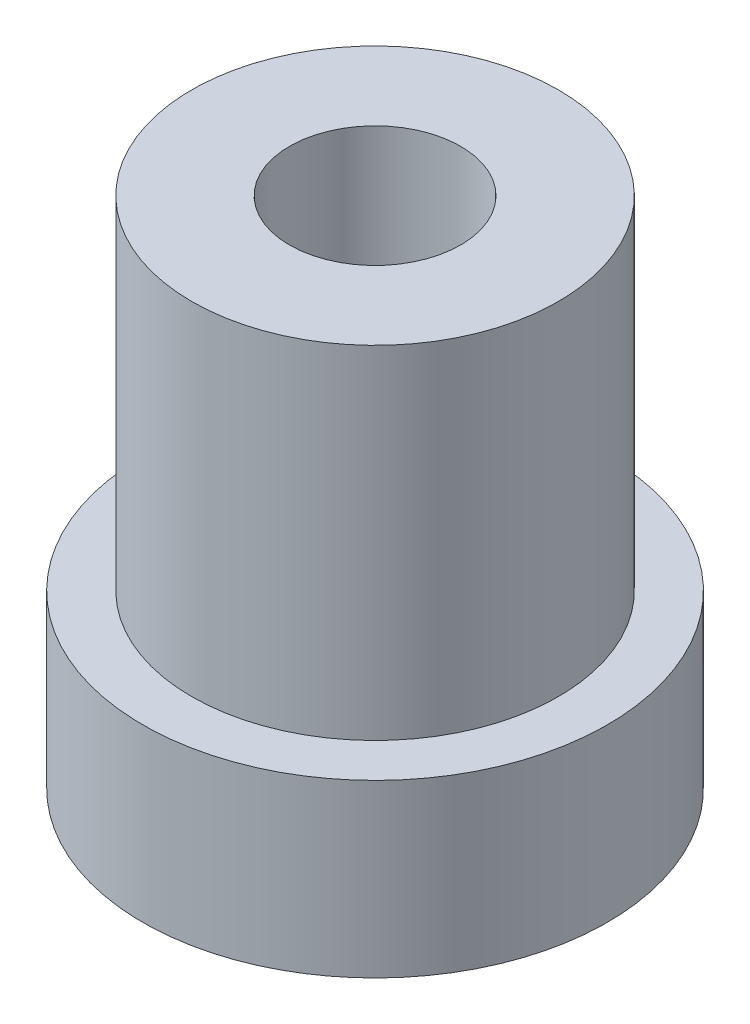
ISO-10303-21;
HEADER;
FILE_DESCRIPTION(('STEP AP214'),'2;1');
FILE_NAME('part.step','',(''),(''),'','','');
FILE_SCHEMA(('AUTOMOTIVE_DESIGN { 1 0 10303 214 1 1 1 1 }'));
ENDSEC;
DATA;
#1=APPLICATION_CONTEXT('core data for automotive mechanical design processes');
#2=APPLICATION_PROTOCOL_DEFINITION('international standard','automotive_design',2000,#1);
#3=PRODUCT_CONTEXT('',#1,'mechanical');
#4=PRODUCT('Part','Part','',(#3));
#5=PRODUCT_RELATED_PRODUCT_CATEGORY('part','',(#4));
#6=PRODUCT_DEFINITION_FORMATION('','',#4);
#7=PRODUCT_DEFINITION_CONTEXT('part definition',#1,'design');
#8=PRODUCT_DEFINITION('design','',#6,#7);
#9=PRODUCT_DEFINITION_SHAPE('','',#8);
#10=(LENGTH_UNIT() NAMED_UNIT(*) SI_UNIT(.MILLI.,.METRE.));
#11=(NAMED_UNIT(*) PLANE_ANGLE_UNIT() SI_UNIT($,.RADIAN.));
#12=(NAMED_UNIT(*) SI_UNIT($,.STERADIAN.) SOLID_ANGLE_UNIT());
#13=UNCERTAINTY_MEASURE_WITH_UNIT(LENGTH_MEASURE(1.E-05),#10,'distance_accuracy_value','');
#14=(GEOMETRIC_REPRESENTATION_CONTEXT(3) GLOBAL_UNCERTAINTY_ASSIGNED_CONTEXT((#13)) GLOBAL_UNIT_ASSIGNED_CONTEXT((#10,
#11,#12)) REPRESENTATION_CONTEXT('',''));
#15=CARTESIAN_POINT('',(0.,0.,0.));
#16=DIRECTION('',(0.,0.,1.));
#17=DIRECTION('',(1.,0.,0.));
#18=AXIS2_PLACEMENT_3D('',#15,#16,#17);
#19=CARTESIAN_POINT('',(0.,10.5,0.));
#20=DIRECTION('',(0.,-1.,0.));
#21=DIRECTION('',(0.,0.,-1.));
#22=AXIS2_PLACEMENT_3D('',#19,#20,#21);
#23=CYLINDRICAL_SURFACE('',#22,3.75);
#24=CARTESIAN_POINT('',(0.,10.5,0.));
#25=DIRECTION('',(0.,1.,0.));
#26=DIRECTION('',(0.,0.,1.));
#27=AXIS2_PLACEMENT_3D('',#24,#25,#26);
#28=CIRCLE('',#27,3.75);
#29=CARTESIAN_POINT('',(0.,10.5,-3.75));
#30=VERTEX_POINT('',#29);
#31=EDGE_CURVE('E50',#30,#30,#28,.T.);
#32=CARTESIAN_POINT('',(0.,3.5,0.));
#33=DIRECTION('',(0.,-1.,0.));
#34=DIRECTION('',(0.,0.,-1.));
#35=AXIS2_PLACEMENT_3D('',#32,#33,#34);
#36=CIRCLE('',#35,3.75);
#37=CARTESIAN_POINT('',(0.,3.5,-3.75));
#38=VERTEX_POINT('',#37);
#39=EDGE_CURVE('E10',#38,#38,#36,.T.);
#40=CARTESIAN_POINT('',(0.,10.5,-3.75));
#41=CARTESIAN_POINT('',(0.,10.4270833333333,-3.75));
#42=CARTESIAN_POINT('',(0.,10.3541666666667,-3.75));
#43=CARTESIAN_POINT('',(0.,10.2083333333333,-3.75));
#44=CARTESIAN_POINT('',(0.,10.1354166666667,-3.75));
#45=CARTESIAN_POINT('',(0.,9.98958333333333,-3.75));
#46=CARTESIAN_POINT('',(0.,9.91666666666667,-3.75));
#47=CARTESIAN_POINT('',(0.,9.77083333333333,-3.75));
#48=CARTESIAN_POINT('',(0.,9.69791666666667,-3.75));
#49=CARTESIAN_POINT('',(0.,9.55208333333333,-3.75));
#50=CARTESIAN_POINT('',(0.,9.47916666666667,-3.75));
#51=CARTESIAN_POINT('',(0.,9.33333333333333,-3.75));
#52=CARTESIAN_POINT('',(0.,9.26041666666667,-3.75));
#53=CARTESIAN_POINT('',(0.,9.11458333333333,-3.75));
#54=CARTESIAN_POINT('',(0.,9.04166666666667,-3.75));
#55=CARTESIAN_POINT('',(0.,8.89583333333333,-3.75));
#56=CARTESIAN_POINT('',(0.,8.82291666666667,-3.75));
#57=CARTESIAN_POINT('',(0.,8.67708333333333,-3.75));
#58=CARTESIAN_POINT('',(0.,8.60416666666667,-3.75));
#59=CARTESIAN_POINT('',(0.,8.45833333333333,-3.75));
#60=CARTESIAN_POINT('',(0.,8.38541666666667,-3.75));
#61=CARTESIAN_POINT('',(0.,8.23958333333333,-3.75));
#62=CARTESIAN_POINT('',(0.,8.16666666666667,-3.75));
#63=CARTESIAN_POINT('',(0.,8.02083333333333,-3.75));
#64=CARTESIAN_POINT('',(0.,7.94791666666667,-3.75));
#65=CARTESIAN_POINT('',(0.,7.80208333333333,-3.75));
#66=CARTESIAN_POINT('',(0.,7.72916666666667,-3.75));
#67=CARTESIAN_POINT('',(0.,7.58333333333333,-3.75));
#68=CARTESIAN_POINT('',(0.,7.51041666666667,-3.75));
#69=CARTESIAN_POINT('',(0.,7.36458333333333,-3.75));
#70=CARTESIAN_POINT('',(0.,7.29166666666667,-3.75));
#71=CARTESIAN_POINT('',(0.,7.14583333333333,-3.75));
#72=CARTESIAN_POINT('',(0.,7.07291666666667,-3.75));
#73=CARTESIAN_POINT('',(0.,6.92708333333333,-3.75));
#74=CARTESIAN_POINT('',(0.,6.85416666666667,-3.75));
#75=CARTESIAN_POINT('',(0.,6.70833333333333,-3.75));
#76=CARTESIAN_POINT('',(0.,6.63541666666667,-3.75));
#77=CARTESIAN_POINT('',(0.,6.48958333333333,-3.75));
#78=CARTESIAN_POINT('',(0.,6.41666666666667,-3.75));
#79=CARTESIAN_POINT('',(0.,6.27083333333333,-3.75));
#80=CARTESIAN_POINT('',(0.,6.19791666666667,-3.75));
#81=CARTESIAN_POINT('',(0.,6.05208333333333,-3.75));
#82=CARTESIAN_POINT('',(0.,5.97916666666667,-3.75));
#83=CARTESIAN_POINT('',(0.,5.83333333333333,-3.75));
#84=CARTESIAN_POINT('',(0.,5.76041666666667,-3.75));
#85=CARTESIAN_POINT('',(0.,5.61458333333333,-3.75));
#86=CARTESIAN_POINT('',(0.,5.54166666666667,-3.75));
#87=CARTESIAN_POINT('',(0.,5.39583333333333,-3.75));
#88=CARTESIAN_POINT('',(0.,5.32291666666667,-3.75));
#89=CARTESIAN_POINT('',(0.,5.17708333333333,-3.75));
#90=CARTESIAN_POINT('',(0.,5.10416666666667,-3.75));
#91=CARTESIAN_POINT('',(0.,4.95833333333333,-3.75));
#92=CARTESIAN_POINT('',(0.,4.88541666666667,-3.75));
#93=CARTESIAN_POINT('',(0.,4.73958333333333,-3.75));
#94=CARTESIAN_POINT('',(0.,4.66666666666667,-3.75));
#95=CARTESIAN_POINT('',(0.,4.52083333333333,-3.75));
#96=CARTESIAN_POINT('',(0.,4.44791666666667,-3.75));
#97=CARTESIAN_POINT('',(0.,4.30208333333333,-3.75));
#98=CARTESIAN_POINT('',(0.,4.22916666666667,-3.75));
#99=CARTESIAN_POINT('',(0.,4.08333333333333,-3.75));
#100=CARTESIAN_POINT('',(0.,4.01041666666667,-3.75));
#101=CARTESIAN_POINT('',(0.,3.86458333333333,-3.75));
#102=CARTESIAN_POINT('',(0.,3.79166666666667,-3.75));
#103=CARTESIAN_POINT('',(0.,3.64583333333333,-3.75));
#104=CARTESIAN_POINT('',(0.,3.57291666666667,-3.75));
#105=CARTESIAN_POINT('',(0.,3.5,-3.75));
#106=B_SPLINE_CURVE_WITH_KNOTS('',3,(#40,#41,#42,#43,#44,#45,#46,#47,#48,#49,#50,#51,#52,#53,
#54,#55,#56,#57,#58,#59,#60,#61,#62,#63,#64,#65,#66,#67,#68,#69,#70,#71,#72,#73,#74,#75,#76,#77,
#78,#79,#80,#81,#82,#83,#84,#85,#86,#87,#88,#89,#90,#91,#92,#93,#94,#95,#96,#97,#98,#99,#100,
#101,#102,#103,#104,#105),.UNSPECIFIED.,.F.,.F.,(4,2,2,2,2,2,2,2,2,2,2,2,2,2,2,2,2,2,2,2,2,2,2,
2,2,2,2,2,2,2,2,2,4),(0.,0.218749999999998,0.437499999999999,0.656249999999999,
0.874999999999999,1.09375,1.3125,1.53125,1.75,1.96875,2.1875,2.40625,2.625,2.84375,3.0625,
3.28125,3.5,3.71875,3.9375,4.15625,4.375,4.59375,4.8125,5.03125,5.25,5.46875,5.6875,5.90625,
6.125,6.34375,6.5625,6.78125,7.),.UNSPECIFIED.);
#107=EDGE_CURVE('BSEAM43',#30,#38,#106,.T.);
#108=ORIENTED_EDGE('',*,*,#31,.F.);
#109=ORIENTED_EDGE('',*,*,#39,.F.);
#110=ORIENTED_EDGE('',*,*,#107,.T.);
#111=ORIENTED_EDGE('',*,*,#107,.F.);
#112=EDGE_LOOP('',(#108,#110,#109,#111));
#113=FACE_BOUND('',#112,.T.);
#114=ADVANCED_FACE('F43',(#113),#23,.T.);
#115=CARTESIAN_POINT('',(0.,10.5,0.));
#116=DIRECTION('',(0.,1.,0.));
#117=DIRECTION('',(0.,0.,1.));
#118=AXIS2_PLACEMENT_3D('',#115,#116,#117);
#119=PLANE('',#118);
#120=CARTESIAN_POINT('',(0.,10.5,0.));
#121=DIRECTION('',(0.,1.,0.));
#122=DIRECTION('',(0.,0.,1.));
#123=AXIS2_PLACEMENT_3D('',#120,#121,#122);
#124=CIRCLE('',#123,1.75);
#125=CARTESIAN_POINT('',(0.,10.5,1.75));
#126=VERTEX_POINT('',#125);
#127=EDGE_CURVE('E60',#126,#126,#124,.T.);
#128=ORIENTED_EDGE('',*,*,#127,.F.);
#129=EDGE_LOOP('',(#128));
#130=FACE_BOUND('',#129,.T.);
#131=ORIENTED_EDGE('',*,*,#31,.T.);
#132=EDGE_LOOP('',(#131));
#133=FACE_BOUND('',#132,.T.);
#134=ADVANCED_FACE('F87',(#130,#133),#119,.T.);
#135=CARTESIAN_POINT('',(0.,0.,0.));
#136=DIRECTION('',(0.,1.,0.));
#137=DIRECTION('',(0.,0.,1.));
#138=AXIS2_PLACEMENT_3D('',#135,#136,#137);
#139=PLANE('',#138);
#140=CARTESIAN_POINT('',(0.,0.,0.));
#141=DIRECTION('',(0.,1.,0.));
#142=DIRECTION('',(0.,0.,1.));
#143=AXIS2_PLACEMENT_3D('',#140,#141,#142);
#144=CIRCLE('',#143,1.75);
#145=CARTESIAN_POINT('',(0.,0.,1.75));
#146=VERTEX_POINT('',#145);
#147=EDGE_CURVE('E55',#146,#146,#144,.T.);
#148=ORIENTED_EDGE('',*,*,#147,.T.);
#149=EDGE_LOOP('',(#148));
#150=FACE_BOUND('',#149,.T.);
#151=CARTESIAN_POINT('',(0.,0.,0.));
#152=DIRECTION('',(0.,-1.,0.));
#153=DIRECTION('',(0.,0.,-1.));
#154=AXIS2_PLACEMENT_3D('',#151,#152,#153);
#155=CIRCLE('',#154,4.75);
#156=CARTESIAN_POINT('',(0.,0.,-4.75));
#157=VERTEX_POINT('',#156);
#158=EDGE_CURVE('E67',#157,#157,#155,.T.);
#159=ORIENTED_EDGE('',*,*,#158,.T.);
#160=EDGE_LOOP('',(#159));
#161=FACE_BOUND('',#160,.T.);
#162=ADVANCED_FACE('F94',(#150,#161),#139,.F.);
#163=CARTESIAN_POINT('',(0.,10.5,0.));
#164=DIRECTION('',(0.,1.,0.));
#165=DIRECTION('',(0.,0.,1.));
#166=AXIS2_PLACEMENT_3D('',#163,#164,#165);
#167=CYLINDRICAL_SURFACE('',#166,1.75);
#168=ORIENTED_EDGE('',*,*,#147,.F.);
#169=EDGE_LOOP('',(#168));
#170=FACE_BOUND('',#169,.T.);
#171=ORIENTED_EDGE('',*,*,#127,.T.);
#172=EDGE_LOOP('',(#171));
#173=FACE_BOUND('',#172,.T.);
#174=ADVANCED_FACE('F84',(#170,#173),#167,.F.);
#175=CARTESIAN_POINT('',(0.,3.5,0.));
#176=DIRECTION('',(0.,-1.,0.));
#177=DIRECTION('',(0.,0.,-1.));
#178=AXIS2_PLACEMENT_3D('',#175,#176,#177);
#179=CYLINDRICAL_SURFACE('',#178,4.75);
#180=CARTESIAN_POINT('',(0.,3.5,0.));
#181=DIRECTION('',(0.,-1.,0.));
#182=DIRECTION('',(0.,0.,-1.));
#183=AXIS2_PLACEMENT_3D('',#180,#181,#182);
#184=CIRCLE('',#183,4.75);
#185=CARTESIAN_POINT('',(0.,3.5,-4.75));
#186=VERTEX_POINT('',#185);
#187=EDGE_CURVE('E66',#186,#186,#184,.T.);
#188=ORIENTED_EDGE('',*,*,#187,.T.);
#189=EDGE_LOOP('',(#188));
#190=FACE_BOUND('',#189,.T.);
#191=ORIENTED_EDGE('',*,*,#158,.F.);
#192=EDGE_LOOP('',(#191));
#193=FACE_BOUND('',#192,.T.);
#194=ADVANCED_FACE('F75',(#190,#193),#179,.T.);
#195=CARTESIAN_POINT('',(0.,3.5,0.));
#196=DIRECTION('',(0.,-1.,0.));
#197=DIRECTION('',(0.,0.,-1.));
#198=AXIS2_PLACEMENT_3D('',#195,#196,#197);
#199=PLANE('',#198);
#200=ORIENTED_EDGE('',*,*,#39,.T.);
#201=EDGE_LOOP('',(#200));
#202=FACE_BOUND('',#201,.T.);
#203=ORIENTED_EDGE('',*,*,#187,.F.);
#204=EDGE_LOOP('',(#203));
#205=FACE_BOUND('',#204,.T.);
#206=ADVANCED_FACE('F78',(#202,#205),#199,.F.);
#207=CLOSED_SHELL('',(#114,#134,#162,#174,#194,#206));
#208=MANIFOLD_SOLID_BREP('B2',#207);
#209=ADVANCED_BREP_SHAPE_REPRESENTATION('',(#18,#208),#14);
#210=SHAPE_DEFINITION_REPRESENTATION(#9,#209);
ENDSEC;
END-ISO-10303-21;
